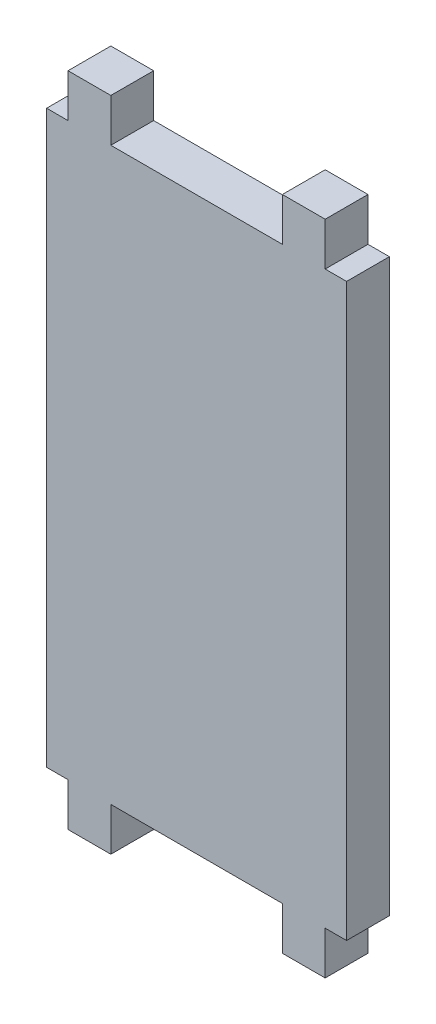
ISO-10303-21;
HEADER;
FILE_DESCRIPTION(('STEP AP214'),'2;1');
FILE_NAME('part.step','',(''),(''),'','','');
FILE_SCHEMA(('AUTOMOTIVE_DESIGN { 1 0 10303 214 1 1 1 1 }'));
ENDSEC;
DATA;
#1=APPLICATION_CONTEXT('core data for automotive mechanical design processes');
#2=APPLICATION_PROTOCOL_DEFINITION('international standard','automotive_design',2000,#1);
#3=PRODUCT_CONTEXT('',#1,'mechanical');
#4=PRODUCT('Part','Part','',(#3));
#5=PRODUCT_RELATED_PRODUCT_CATEGORY('part','',(#4));
#6=PRODUCT_DEFINITION_FORMATION('','',#4);
#7=PRODUCT_DEFINITION_CONTEXT('part definition',#1,'design');
#8=PRODUCT_DEFINITION('design','',#6,#7);
#9=PRODUCT_DEFINITION_SHAPE('','',#8);
#10=(LENGTH_UNIT() NAMED_UNIT(*) SI_UNIT(.MILLI.,.METRE.));
#11=(NAMED_UNIT(*) PLANE_ANGLE_UNIT() SI_UNIT($,.RADIAN.));
#12=(NAMED_UNIT(*) SI_UNIT($,.STERADIAN.) SOLID_ANGLE_UNIT());
#13=UNCERTAINTY_MEASURE_WITH_UNIT(LENGTH_MEASURE(1.E-05),#10,'distance_accuracy_value','');
#14=(GEOMETRIC_REPRESENTATION_CONTEXT(3) GLOBAL_UNCERTAINTY_ASSIGNED_CONTEXT((#13)) GLOBAL_UNIT_ASSIGNED_CONTEXT((#10,
#11,#12)) REPRESENTATION_CONTEXT('',''));
#15=CARTESIAN_POINT('',(0.,0.,0.));
#16=DIRECTION('',(0.,0.,1.));
#17=DIRECTION('',(1.,0.,0.));
#18=AXIS2_PLACEMENT_3D('',#15,#16,#17);
#19=CARTESIAN_POINT('',(31.9795138603937,110.,6.));
#20=DIRECTION('',(0.999999999991622,-4.09344864245869E-06,0.));
#21=DIRECTION('',(4.0934486424587E-06,0.999999999991622,0.));
#22=AXIS2_PLACEMENT_3D('',#19,#20,#21);
#23=PLANE('',#22);
#24=DIRECTION('',(-4.0934486424587E-06,-0.999999999991622,0.));
#25=VECTOR('',#24,1.);
#26=CARTESIAN_POINT('',(31.9795138603937,110.,0.));
#27=LINE('',#26,#25);
#28=CARTESIAN_POINT('',(31.9795138603937,110.,0.));
#29=VERTEX_POINT('',#28);
#30=CARTESIAN_POINT('',(31.9794890950294,103.95,0.));
#31=VERTEX_POINT('',#30);
#32=EDGE_CURVE('E202',#29,#31,#27,.T.);
#33=ORIENTED_EDGE('',*,*,#32,.T.);
#34=DIRECTION('',(0.,0.,-1.));
#35=VECTOR('',#34,1.);
#36=CARTESIAN_POINT('',(31.9794890950294,103.95,6.));
#37=LINE('',#36,#35);
#38=CARTESIAN_POINT('',(31.9794890950294,103.95,6.));
#39=VERTEX_POINT('',#38);
#40=EDGE_CURVE('E11',#39,#31,#37,.T.);
#41=ORIENTED_EDGE('',*,*,#40,.F.);
#42=DIRECTION('',(-4.0934486424587E-06,-0.999999999991622,0.));
#43=VECTOR('',#42,1.);
#44=CARTESIAN_POINT('',(31.9795138603937,110.,6.));
#45=LINE('',#44,#43);
#46=CARTESIAN_POINT('',(31.9795138603937,110.,6.));
#47=VERTEX_POINT('',#46);
#48=EDGE_CURVE('E240',#47,#39,#45,.T.);
#49=ORIENTED_EDGE('',*,*,#48,.F.);
#50=DIRECTION('',(0.,0.,-1.));
#51=VECTOR('',#50,1.);
#52=CARTESIAN_POINT('',(31.9795138603937,110.,6.));
#53=LINE('',#52,#51);
#54=EDGE_CURVE('E198',#47,#29,#53,.T.);
#55=ORIENTED_EDGE('',*,*,#54,.T.);
#56=EDGE_LOOP('',(#33,#41,#49,#55));
#57=FACE_BOUND('',#56,.T.);
#58=ADVANCED_FACE('F34',(#57),#23,.F.);
#59=CARTESIAN_POINT('',(31.9794890950294,103.95,6.));
#60=DIRECTION('',(0.,1.,0.));
#61=DIRECTION('',(0.,0.,1.));
#62=AXIS2_PLACEMENT_3D('',#59,#60,#61);
#63=PLANE('',#62);
#64=DIRECTION('',(1.,0.,0.));
#65=VECTOR('',#64,1.);
#66=CARTESIAN_POINT('',(31.9794890950294,103.95,0.));
#67=LINE('',#66,#65);
#68=CARTESIAN_POINT('',(37.9794890950797,103.95,0.));
#69=VERTEX_POINT('',#68);
#70=EDGE_CURVE('E205',#31,#69,#67,.T.);
#71=ORIENTED_EDGE('',*,*,#70,.T.);
#72=DIRECTION('',(0.,0.,-1.));
#73=VECTOR('',#72,1.);
#74=CARTESIAN_POINT('',(37.9794890950797,103.95,6.));
#75=LINE('',#74,#73);
#76=CARTESIAN_POINT('',(37.9794890950797,103.95,6.));
#77=VERTEX_POINT('',#76);
#78=EDGE_CURVE('E42',#77,#69,#75,.T.);
#79=ORIENTED_EDGE('',*,*,#78,.F.);
#80=DIRECTION('',(1.,0.,0.));
#81=VECTOR('',#80,1.);
#82=CARTESIAN_POINT('',(31.9794890950294,103.95,6.));
#83=LINE('',#82,#81);
#84=EDGE_CURVE('E129',#39,#77,#83,.T.);
#85=ORIENTED_EDGE('',*,*,#84,.F.);
#86=ORIENTED_EDGE('',*,*,#40,.T.);
#87=EDGE_LOOP('',(#71,#79,#85,#86));
#88=FACE_BOUND('',#87,.T.);
#89=ADVANCED_FACE('F358',(#88),#63,.F.);
#90=CARTESIAN_POINT('',(37.9795138604438,110.,6.));
#91=DIRECTION('',(-0.999999999991622,4.0934486241079E-06,0.));
#92=DIRECTION('',(-4.0934486241079E-06,-0.999999999991622,0.));
#93=AXIS2_PLACEMENT_3D('',#90,#91,#92);
#94=PLANE('',#93);
#95=DIRECTION('',(4.0934486241079E-06,0.999999999991622,0.));
#96=VECTOR('',#95,1.);
#97=CARTESIAN_POINT('',(37.9795138604438,110.,0.));
#98=LINE('',#97,#96);
#99=CARTESIAN_POINT('',(37.9795138604438,110.,0.));
#100=VERTEX_POINT('',#99);
#101=EDGE_CURVE('E207',#69,#100,#98,.T.);
#102=ORIENTED_EDGE('',*,*,#101,.T.);
#103=DIRECTION('',(0.,0.,-1.));
#104=VECTOR('',#103,1.);
#105=CARTESIAN_POINT('',(37.9795138604438,110.,6.));
#106=LINE('',#105,#104);
#107=CARTESIAN_POINT('',(37.9795138604438,110.,6.));
#108=VERTEX_POINT('',#107);
#109=EDGE_CURVE('E283',#108,#100,#106,.T.);
#110=ORIENTED_EDGE('',*,*,#109,.F.);
#111=DIRECTION('',(4.0934486241079E-06,0.999999999991622,0.));
#112=VECTOR('',#111,1.);
#113=CARTESIAN_POINT('',(37.9795138604438,110.,6.));
#114=LINE('',#113,#112);
#115=EDGE_CURVE('E291',#77,#108,#114,.T.);
#116=ORIENTED_EDGE('',*,*,#115,.F.);
#117=ORIENTED_EDGE('',*,*,#78,.T.);
#118=EDGE_LOOP('',(#102,#110,#116,#117));
#119=FACE_BOUND('',#118,.T.);
#120=ADVANCED_FACE('F289',(#119),#94,.F.);
#121=CARTESIAN_POINT('',(37.9795138604438,110.,6.));
#122=DIRECTION('',(0.,1.,0.));
#123=DIRECTION('',(0.,0.,1.));
#124=AXIS2_PLACEMENT_3D('',#121,#122,#123);
#125=PLANE('',#124);
#126=DIRECTION('',(1.,0.,0.));
#127=VECTOR('',#126,1.);
#128=CARTESIAN_POINT('',(37.9795138604438,110.,0.));
#129=LINE('',#128,#127);
#130=CARTESIAN_POINT('',(62.0197554376846,110.,0.));
#131=VERTEX_POINT('',#130);
#132=EDGE_CURVE('E209',#100,#131,#129,.T.);
#133=ORIENTED_EDGE('',*,*,#132,.T.);
#134=DIRECTION('',(0.,0.,-1.));
#135=VECTOR('',#134,1.);
#136=CARTESIAN_POINT('',(62.0197554376846,110.,6.));
#137=LINE('',#136,#135);
#138=CARTESIAN_POINT('',(62.0197554376846,110.,6.));
#139=VERTEX_POINT('',#138);
#140=EDGE_CURVE('E280',#139,#131,#137,.T.);
#141=ORIENTED_EDGE('',*,*,#140,.F.);
#142=DIRECTION('',(1.,0.,0.));
#143=VECTOR('',#142,1.);
#144=CARTESIAN_POINT('',(37.9795138604438,110.,6.));
#145=LINE('',#144,#143);
#146=EDGE_CURVE('E309',#108,#139,#145,.T.);
#147=ORIENTED_EDGE('',*,*,#146,.F.);
#148=ORIENTED_EDGE('',*,*,#109,.T.);
#149=EDGE_LOOP('',(#133,#141,#147,#148));
#150=FACE_BOUND('',#149,.T.);
#151=ADVANCED_FACE('F300',(#150),#125,.F.);
#152=CARTESIAN_POINT('',(62.0196696845161,103.95,6.));
#153=DIRECTION('',(0.999999999899548,-1.41740774406321E-05,0.));
#154=DIRECTION('',(1.41740774406321E-05,0.999999999899548,0.));
#155=AXIS2_PLACEMENT_3D('',#152,#153,#154);
#156=PLANE('',#155);
#157=DIRECTION('',(-1.41740774406321E-05,-0.999999999899548,0.));
#158=VECTOR('',#157,1.);
#159=CARTESIAN_POINT('',(62.0196696845161,103.95,0.));
#160=LINE('',#159,#158);
#161=CARTESIAN_POINT('',(62.0196696845161,103.95,0.));
#162=VERTEX_POINT('',#161);
#163=EDGE_CURVE('E211',#131,#162,#160,.T.);
#164=ORIENTED_EDGE('',*,*,#163,.T.);
#165=DIRECTION('',(0.,0.,-1.));
#166=VECTOR('',#165,1.);
#167=CARTESIAN_POINT('',(62.0196696845161,103.95,6.));
#168=LINE('',#167,#166);
#169=CARTESIAN_POINT('',(62.0196696845161,103.95,6.));
#170=VERTEX_POINT('',#169);
#171=EDGE_CURVE('E277',#170,#162,#168,.T.);
#172=ORIENTED_EDGE('',*,*,#171,.F.);
#173=DIRECTION('',(-1.41740774406321E-05,-0.999999999899548,0.));
#174=VECTOR('',#173,1.);
#175=CARTESIAN_POINT('',(62.0196696845161,103.95,6.));
#176=LINE('',#175,#174);
#177=EDGE_CURVE('E306',#139,#170,#176,.T.);
#178=ORIENTED_EDGE('',*,*,#177,.F.);
#179=ORIENTED_EDGE('',*,*,#140,.T.);
#180=EDGE_LOOP('',(#164,#172,#178,#179));
#181=FACE_BOUND('',#180,.T.);
#182=ADVANCED_FACE('F304',(#181),#156,.F.);
#183=CARTESIAN_POINT('',(62.0196696845161,103.95,6.));
#184=DIRECTION('',(0.,1.,0.));
#185=DIRECTION('',(0.,0.,1.));
#186=AXIS2_PLACEMENT_3D('',#183,#184,#185);
#187=PLANE('',#186);
#188=DIRECTION('',(1.,0.,0.));
#189=VECTOR('',#188,1.);
#190=CARTESIAN_POINT('',(62.0196696845161,103.95,0.));
#191=LINE('',#190,#189);
#192=CARTESIAN_POINT('',(68.0196696851188,103.95,0.));
#193=VERTEX_POINT('',#192);
#194=EDGE_CURVE('E213',#162,#193,#191,.T.);
#195=ORIENTED_EDGE('',*,*,#194,.T.);
#196=DIRECTION('',(0.,0.,-1.));
#197=VECTOR('',#196,1.);
#198=CARTESIAN_POINT('',(68.0196696851188,103.95,6.));
#199=LINE('',#198,#197);
#200=CARTESIAN_POINT('',(68.0196696851188,103.95,6.));
#201=VERTEX_POINT('',#200);
#202=EDGE_CURVE('E274',#201,#193,#199,.T.);
#203=ORIENTED_EDGE('',*,*,#202,.F.);
#204=DIRECTION('',(1.,0.,0.));
#205=VECTOR('',#204,1.);
#206=CARTESIAN_POINT('',(62.0196696845161,103.95,6.));
#207=LINE('',#206,#205);
#208=EDGE_CURVE('E308',#170,#201,#207,.T.);
#209=ORIENTED_EDGE('',*,*,#208,.F.);
#210=ORIENTED_EDGE('',*,*,#171,.T.);
#211=EDGE_LOOP('',(#195,#203,#209,#210));
#212=FACE_BOUND('',#211,.T.);
#213=ADVANCED_FACE('F371',(#212),#187,.F.);
#214=CARTESIAN_POINT('',(68.0196696851188,103.95,6.));
#215=DIRECTION('',(-0.999999999899548,1.41740774406321E-05,0.));
#216=DIRECTION('',(-1.41740774406321E-05,-0.999999999899548,0.));
#217=AXIS2_PLACEMENT_3D('',#214,#215,#216);
#218=PLANE('',#217);
#219=DIRECTION('',(1.41740774406321E-05,0.999999999899548,0.));
#220=VECTOR('',#219,1.);
#221=CARTESIAN_POINT('',(68.0196696851188,103.95,0.));
#222=LINE('',#221,#220);
#223=CARTESIAN_POINT('',(68.0197554382873,110.,0.));
#224=VERTEX_POINT('',#223);
#225=EDGE_CURVE('E215',#193,#224,#222,.T.);
#226=ORIENTED_EDGE('',*,*,#225,.T.);
#227=DIRECTION('',(0.,0.,-1.));
#228=VECTOR('',#227,1.);
#229=CARTESIAN_POINT('',(68.0197554382873,110.,6.));
#230=LINE('',#229,#228);
#231=CARTESIAN_POINT('',(68.0197554382873,110.,6.));
#232=VERTEX_POINT('',#231);
#233=EDGE_CURVE('E271',#232,#224,#230,.T.);
#234=ORIENTED_EDGE('',*,*,#233,.F.);
#235=DIRECTION('',(1.41740774406321E-05,0.999999999899548,0.));
#236=VECTOR('',#235,1.);
#237=CARTESIAN_POINT('',(68.0196696851188,103.95,6.));
#238=LINE('',#237,#236);
#239=EDGE_CURVE('E311',#201,#232,#238,.T.);
#240=ORIENTED_EDGE('',*,*,#239,.F.);
#241=ORIENTED_EDGE('',*,*,#202,.T.);
#242=EDGE_LOOP('',(#226,#234,#240,#241));
#243=FACE_BOUND('',#242,.T.);
#244=ADVANCED_FACE('F374',(#243),#218,.F.);
#245=CARTESIAN_POINT('',(68.0197554382873,110.,6.));
#246=DIRECTION('',(0.,1.,0.));
#247=DIRECTION('',(0.,0.,1.));
#248=AXIS2_PLACEMENT_3D('',#245,#246,#247);
#249=PLANE('',#248);
#250=DIRECTION('',(1.,0.,0.));
#251=VECTOR('',#250,1.);
#252=CARTESIAN_POINT('',(68.0197554382873,110.,0.));
#253=LINE('',#252,#251);
#254=CARTESIAN_POINT('',(71.0197554385887,110.,0.));
#255=VERTEX_POINT('',#254);
#256=EDGE_CURVE('E217',#224,#255,#253,.T.);
#257=ORIENTED_EDGE('',*,*,#256,.T.);
#258=DIRECTION('',(0.,0.,-1.));
#259=VECTOR('',#258,1.);
#260=CARTESIAN_POINT('',(71.0197554385887,110.,6.));
#261=LINE('',#260,#259);
#262=CARTESIAN_POINT('',(71.0197554385887,110.,6.));
#263=VERTEX_POINT('',#262);
#264=EDGE_CURVE('E268',#263,#255,#261,.T.);
#265=ORIENTED_EDGE('',*,*,#264,.F.);
#266=DIRECTION('',(1.,0.,0.));
#267=VECTOR('',#266,1.);
#268=CARTESIAN_POINT('',(68.0197554382873,110.,6.));
#269=LINE('',#268,#267);
#270=EDGE_CURVE('E317',#232,#263,#269,.T.);
#271=ORIENTED_EDGE('',*,*,#270,.F.);
#272=ORIENTED_EDGE('',*,*,#233,.T.);
#273=EDGE_LOOP('',(#257,#265,#271,#272));
#274=FACE_BOUND('',#273,.T.);
#275=ADVANCED_FACE('F378',(#274),#249,.F.);
#276=CARTESIAN_POINT('',(71.0197554385887,110.,6.));
#277=DIRECTION('',(-0.999999999899548,1.41740774398436E-05,0.));
#278=DIRECTION('',(-1.41740774398436E-05,-0.999999999899548,0.));
#279=AXIS2_PLACEMENT_3D('',#276,#277,#278);
#280=PLANE('',#279);
#281=DIRECTION('',(1.41740774398436E-05,0.999999999899548,0.));
#282=VECTOR('',#281,1.);
#283=CARTESIAN_POINT('',(71.0197554385887,110.,0.));
#284=LINE('',#283,#282);
#285=CARTESIAN_POINT('',(71.020889364784,190.,0.));
#286=VERTEX_POINT('',#285);
#287=EDGE_CURVE('E219',#255,#286,#284,.T.);
#288=ORIENTED_EDGE('',*,*,#287,.T.);
#289=DIRECTION('',(0.,0.,-1.));
#290=VECTOR('',#289,1.);
#291=CARTESIAN_POINT('',(71.020889364784,190.,6.));
#292=LINE('',#291,#290);
#293=CARTESIAN_POINT('',(71.020889364784,190.,6.));
#294=VERTEX_POINT('',#293);
#295=EDGE_CURVE('E265',#294,#286,#292,.T.);
#296=ORIENTED_EDGE('',*,*,#295,.F.);
#297=DIRECTION('',(1.41740774398436E-05,0.999999999899548,0.));
#298=VECTOR('',#297,1.);
#299=CARTESIAN_POINT('',(71.0197554385887,110.,6.));
#300=LINE('',#299,#298);
#301=EDGE_CURVE('E319',#263,#294,#300,.T.);
#302=ORIENTED_EDGE('',*,*,#301,.F.);
#303=ORIENTED_EDGE('',*,*,#264,.T.);
#304=EDGE_LOOP('',(#288,#296,#302,#303));
#305=FACE_BOUND('',#304,.T.);
#306=ADVANCED_FACE('F382',(#305),#280,.F.);
#307=CARTESIAN_POINT('',(68.0208893644827,190.,6.));
#308=DIRECTION('',(0.,-1.,0.));
#309=DIRECTION('',(0.,0.,-1.));
#310=AXIS2_PLACEMENT_3D('',#307,#308,#309);
#311=PLANE('',#310);
#312=DIRECTION('',(-1.,0.,0.));
#313=VECTOR('',#312,1.);
#314=CARTESIAN_POINT('',(68.0208893644827,190.,0.));
#315=LINE('',#314,#313);
#316=CARTESIAN_POINT('',(68.0208893644827,190.,0.));
#317=VERTEX_POINT('',#316);
#318=EDGE_CURVE('E221',#286,#317,#315,.T.);
#319=ORIENTED_EDGE('',*,*,#318,.T.);
#320=DIRECTION('',(0.,0.,-1.));
#321=VECTOR('',#320,1.);
#322=CARTESIAN_POINT('',(68.0208893644827,190.,6.));
#323=LINE('',#322,#321);
#324=CARTESIAN_POINT('',(68.0208893644827,190.,6.));
#325=VERTEX_POINT('',#324);
#326=EDGE_CURVE('E262',#325,#317,#323,.T.);
#327=ORIENTED_EDGE('',*,*,#326,.F.);
#328=DIRECTION('',(-1.,0.,0.));
#329=VECTOR('',#328,1.);
#330=CARTESIAN_POINT('',(68.0208893644827,190.,6.));
#331=LINE('',#330,#329);
#332=EDGE_CURVE('E321',#294,#325,#331,.T.);
#333=ORIENTED_EDGE('',*,*,#332,.F.);
#334=ORIENTED_EDGE('',*,*,#295,.T.);
#335=EDGE_LOOP('',(#319,#327,#333,#334));
#336=FACE_BOUND('',#335,.T.);
#337=ADVANCED_FACE('F386',(#336),#311,.F.);
#338=CARTESIAN_POINT('',(68.0208893644827,190.,6.));
#339=DIRECTION('',(-0.999999999899548,1.41740774406321E-05,0.));
#340=DIRECTION('',(-1.41740774406321E-05,-0.999999999899548,0.));
#341=AXIS2_PLACEMENT_3D('',#338,#339,#340);
#342=PLANE('',#341);
#343=DIRECTION('',(1.41740774406321E-05,0.999999999899548,0.));
#344=VECTOR('',#343,1.);
#345=CARTESIAN_POINT('',(68.0208893644827,190.,0.));
#346=LINE('',#345,#344);
#347=CARTESIAN_POINT('',(68.0209751176512,196.05,0.));
#348=VERTEX_POINT('',#347);
#349=EDGE_CURVE('E223',#317,#348,#346,.T.);
#350=ORIENTED_EDGE('',*,*,#349,.T.);
#351=DIRECTION('',(0.,0.,-1.));
#352=VECTOR('',#351,1.);
#353=CARTESIAN_POINT('',(68.0209751176512,196.05,6.));
#354=LINE('',#353,#352);
#355=CARTESIAN_POINT('',(68.0209751176512,196.05,6.));
#356=VERTEX_POINT('',#355);
#357=EDGE_CURVE('E259',#356,#348,#354,.T.);
#358=ORIENTED_EDGE('',*,*,#357,.F.);
#359=DIRECTION('',(1.41740774406321E-05,0.999999999899548,0.));
#360=VECTOR('',#359,1.);
#361=CARTESIAN_POINT('',(68.0208893644827,190.,6.));
#362=LINE('',#361,#360);
#363=EDGE_CURVE('E323',#325,#356,#362,.T.);
#364=ORIENTED_EDGE('',*,*,#363,.F.);
#365=ORIENTED_EDGE('',*,*,#326,.T.);
#366=EDGE_LOOP('',(#350,#358,#364,#365));
#367=FACE_BOUND('',#366,.T.);
#368=ADVANCED_FACE('F390',(#367),#342,.F.);
#369=CARTESIAN_POINT('',(62.0209751170485,196.05,6.));
#370=DIRECTION('',(0.,-1.,0.));
#371=DIRECTION('',(0.,0.,-1.));
#372=AXIS2_PLACEMENT_3D('',#369,#370,#371);
#373=PLANE('',#372);
#374=DIRECTION('',(-1.,0.,0.));
#375=VECTOR('',#374,1.);
#376=CARTESIAN_POINT('',(62.0209751170485,196.05,0.));
#377=LINE('',#376,#375);
#378=CARTESIAN_POINT('',(62.0209751170485,196.05,0.));
#379=VERTEX_POINT('',#378);
#380=EDGE_CURVE('E225',#348,#379,#377,.T.);
#381=ORIENTED_EDGE('',*,*,#380,.T.);
#382=DIRECTION('',(0.,0.,-1.));
#383=VECTOR('',#382,1.);
#384=CARTESIAN_POINT('',(62.0209751170485,196.05,6.));
#385=LINE('',#384,#383);
#386=CARTESIAN_POINT('',(62.0209751170485,196.05,6.));
#387=VERTEX_POINT('',#386);
#388=EDGE_CURVE('E256',#387,#379,#385,.T.);
#389=ORIENTED_EDGE('',*,*,#388,.F.);
#390=DIRECTION('',(-1.,0.,0.));
#391=VECTOR('',#390,1.);
#392=CARTESIAN_POINT('',(62.0209751170485,196.05,6.));
#393=LINE('',#392,#391);
#394=EDGE_CURVE('E325',#356,#387,#393,.T.);
#395=ORIENTED_EDGE('',*,*,#394,.F.);
#396=ORIENTED_EDGE('',*,*,#357,.T.);
#397=EDGE_LOOP('',(#381,#389,#395,#396));
#398=FACE_BOUND('',#397,.T.);
#399=ADVANCED_FACE('F394',(#398),#373,.F.);
#400=CARTESIAN_POINT('',(62.02088936388,190.,6.));
#401=DIRECTION('',(0.999999999899548,-1.41740774394852E-05,0.));
#402=DIRECTION('',(1.41740774394852E-05,0.999999999899548,0.));
#403=AXIS2_PLACEMENT_3D('',#400,#401,#402);
#404=PLANE('',#403);
#405=DIRECTION('',(-1.41740774394852E-05,-0.999999999899548,0.));
#406=VECTOR('',#405,1.);
#407=CARTESIAN_POINT('',(62.02088936388,190.,0.));
#408=LINE('',#407,#406);
#409=CARTESIAN_POINT('',(62.02088936388,190.,0.));
#410=VERTEX_POINT('',#409);
#411=EDGE_CURVE('E227',#379,#410,#408,.T.);
#412=ORIENTED_EDGE('',*,*,#411,.T.);
#413=DIRECTION('',(0.,0.,-1.));
#414=VECTOR('',#413,1.);
#415=CARTESIAN_POINT('',(62.02088936388,190.,6.));
#416=LINE('',#415,#414);
#417=CARTESIAN_POINT('',(62.02088936388,190.,6.));
#418=VERTEX_POINT('',#417);
#419=EDGE_CURVE('E253',#418,#410,#416,.T.);
#420=ORIENTED_EDGE('',*,*,#419,.F.);
#421=DIRECTION('',(-1.41740774394852E-05,-0.999999999899548,0.));
#422=VECTOR('',#421,1.);
#423=CARTESIAN_POINT('',(62.02088936388,190.,6.));
#424=LINE('',#423,#422);
#425=EDGE_CURVE('E327',#387,#418,#424,.T.);
#426=ORIENTED_EDGE('',*,*,#425,.F.);
#427=ORIENTED_EDGE('',*,*,#388,.T.);
#428=EDGE_LOOP('',(#412,#420,#426,#427));
#429=FACE_BOUND('',#428,.T.);
#430=ADVANCED_FACE('F398',(#429),#404,.F.);
#431=CARTESIAN_POINT('',(37.9798413363337,190.,6.));
#432=DIRECTION('',(0.,-1.,0.));
#433=DIRECTION('',(0.,0.,-1.));
#434=AXIS2_PLACEMENT_3D('',#431,#432,#433);
#435=PLANE('',#434);
#436=DIRECTION('',(-1.,0.,0.));
#437=VECTOR('',#436,1.);
#438=CARTESIAN_POINT('',(37.9798413363337,190.,0.));
#439=LINE('',#438,#437);
#440=CARTESIAN_POINT('',(37.9798413363337,190.,0.));
#441=VERTEX_POINT('',#440);
#442=EDGE_CURVE('E229',#410,#441,#439,.T.);
#443=ORIENTED_EDGE('',*,*,#442,.T.);
#444=DIRECTION('',(0.,0.,-1.));
#445=VECTOR('',#444,1.);
#446=CARTESIAN_POINT('',(37.9798413363337,190.,6.));
#447=LINE('',#446,#445);
#448=CARTESIAN_POINT('',(37.9798413363337,190.,6.));
#449=VERTEX_POINT('',#448);
#450=EDGE_CURVE('E250',#449,#441,#447,.T.);
#451=ORIENTED_EDGE('',*,*,#450,.F.);
#452=DIRECTION('',(-1.,0.,0.));
#453=VECTOR('',#452,1.);
#454=CARTESIAN_POINT('',(37.9798413363337,190.,6.));
#455=LINE('',#454,#453);
#456=EDGE_CURVE('E329',#418,#449,#455,.T.);
#457=ORIENTED_EDGE('',*,*,#456,.F.);
#458=ORIENTED_EDGE('',*,*,#419,.T.);
#459=EDGE_LOOP('',(#443,#451,#457,#458));
#460=FACE_BOUND('',#459,.T.);
#461=ADVANCED_FACE('F402',(#460),#435,.F.);
#462=CARTESIAN_POINT('',(37.9798661016979,196.05,6.));
#463=DIRECTION('',(-0.999999999991622,4.09344862410791E-06,0.));
#464=DIRECTION('',(-4.09344862410791E-06,-0.999999999991622,0.));
#465=AXIS2_PLACEMENT_3D('',#462,#463,#464);
#466=PLANE('',#465);
#467=DIRECTION('',(4.09344862410791E-06,0.999999999991622,0.));
#468=VECTOR('',#467,1.);
#469=CARTESIAN_POINT('',(37.9798661016979,196.05,0.));
#470=LINE('',#469,#468);
#471=CARTESIAN_POINT('',(37.9798661016979,196.05,0.));
#472=VERTEX_POINT('',#471);
#473=EDGE_CURVE('E231',#441,#472,#470,.T.);
#474=ORIENTED_EDGE('',*,*,#473,.T.);
#475=DIRECTION('',(0.,0.,-1.));
#476=VECTOR('',#475,1.);
#477=CARTESIAN_POINT('',(37.9798661016979,196.05,6.));
#478=LINE('',#477,#476);
#479=CARTESIAN_POINT('',(37.9798661016979,196.05,6.));
#480=VERTEX_POINT('',#479);
#481=EDGE_CURVE('E247',#480,#472,#478,.T.);
#482=ORIENTED_EDGE('',*,*,#481,.F.);
#483=DIRECTION('',(4.09344862410791E-06,0.999999999991622,0.));
#484=VECTOR('',#483,1.);
#485=CARTESIAN_POINT('',(37.9798661016979,196.05,6.));
#486=LINE('',#485,#484);
#487=EDGE_CURVE('E331',#449,#480,#486,.T.);
#488=ORIENTED_EDGE('',*,*,#487,.F.);
#489=ORIENTED_EDGE('',*,*,#450,.T.);
#490=EDGE_LOOP('',(#474,#482,#488,#489));
#491=FACE_BOUND('',#490,.T.);
#492=ADVANCED_FACE('F406',(#491),#466,.F.);
#493=CARTESIAN_POINT('',(31.9798661016486,196.05,6.));
#494=DIRECTION('',(0.,-1.,0.));
#495=DIRECTION('',(0.,0.,-1.));
#496=AXIS2_PLACEMENT_3D('',#493,#494,#495);
#497=PLANE('',#496);
#498=DIRECTION('',(-1.,0.,0.));
#499=VECTOR('',#498,1.);
#500=CARTESIAN_POINT('',(31.9798661016486,196.05,0.));
#501=LINE('',#500,#499);
#502=CARTESIAN_POINT('',(31.9798661016486,196.05,0.));
#503=VERTEX_POINT('',#502);
#504=EDGE_CURVE('E233',#472,#503,#501,.T.);
#505=ORIENTED_EDGE('',*,*,#504,.T.);
#506=DIRECTION('',(0.,0.,-1.));
#507=VECTOR('',#506,1.);
#508=CARTESIAN_POINT('',(31.9798661016486,196.05,6.));
#509=LINE('',#508,#507);
#510=CARTESIAN_POINT('',(31.9798661016486,196.05,6.));
#511=VERTEX_POINT('',#510);
#512=EDGE_CURVE('E244',#511,#503,#509,.T.);
#513=ORIENTED_EDGE('',*,*,#512,.F.);
#514=DIRECTION('',(-1.,0.,0.));
#515=VECTOR('',#514,1.);
#516=CARTESIAN_POINT('',(31.9798661016486,196.05,6.));
#517=LINE('',#516,#515);
#518=EDGE_CURVE('E333',#480,#511,#517,.T.);
#519=ORIENTED_EDGE('',*,*,#518,.F.);
#520=ORIENTED_EDGE('',*,*,#481,.T.);
#521=EDGE_LOOP('',(#505,#513,#519,#520));
#522=FACE_BOUND('',#521,.T.);
#523=ADVANCED_FACE('F339',(#522),#497,.F.);
#524=CARTESIAN_POINT('',(31.9798661016486,196.05,6.));
#525=DIRECTION('',(0.999999999991622,-4.0934486424587E-06,0.));
#526=DIRECTION('',(4.0934486424587E-06,0.999999999991622,0.));
#527=AXIS2_PLACEMENT_3D('',#524,#525,#526);
#528=PLANE('',#527);
#529=DIRECTION('',(-4.0934486424587E-06,-0.999999999991622,0.));
#530=VECTOR('',#529,1.);
#531=CARTESIAN_POINT('',(31.9798661016486,196.05,0.));
#532=LINE('',#531,#530);
#533=CARTESIAN_POINT('',(31.9798413362843,190.,0.));
#534=VERTEX_POINT('',#533);
#535=EDGE_CURVE('E235',#503,#534,#532,.T.);
#536=ORIENTED_EDGE('',*,*,#535,.T.);
#537=DIRECTION('',(0.,0.,-1.));
#538=VECTOR('',#537,1.);
#539=CARTESIAN_POINT('',(31.9798413362843,190.,6.));
#540=LINE('',#539,#538);
#541=CARTESIAN_POINT('',(31.9798413362843,190.,6.));
#542=VERTEX_POINT('',#541);
#543=EDGE_CURVE('E193',#542,#534,#540,.T.);
#544=ORIENTED_EDGE('',*,*,#543,.F.);
#545=DIRECTION('',(-4.0934486424587E-06,-0.999999999991622,0.));
#546=VECTOR('',#545,1.);
#547=CARTESIAN_POINT('',(31.9798661016486,196.05,6.));
#548=LINE('',#547,#546);
#549=EDGE_CURVE('E184',#511,#542,#548,.T.);
#550=ORIENTED_EDGE('',*,*,#549,.F.);
#551=ORIENTED_EDGE('',*,*,#512,.T.);
#552=EDGE_LOOP('',(#536,#544,#550,#551));
#553=FACE_BOUND('',#552,.T.);
#554=ADVANCED_FACE('F343',(#553),#528,.F.);
#555=CARTESIAN_POINT('',(28.9794890950043,190.,6.));
#556=DIRECTION('',(0.,-1.,0.));
#557=DIRECTION('',(0.,0.,-1.));
#558=AXIS2_PLACEMENT_3D('',#555,#556,#557);
#559=PLANE('',#558);
#560=DIRECTION('',(-1.,0.,0.));
#561=VECTOR('',#560,1.);
#562=CARTESIAN_POINT('',(28.9794890950043,190.,0.));
#563=LINE('',#562,#561);
#564=CARTESIAN_POINT('',(28.9794890950043,190.,0.));
#565=VERTEX_POINT('',#564);
#566=EDGE_CURVE('E192',#534,#565,#563,.T.);
#567=ORIENTED_EDGE('',*,*,#566,.T.);
#568=DIRECTION('',(0.,0.,-1.));
#569=VECTOR('',#568,1.);
#570=CARTESIAN_POINT('',(28.9794890950043,190.,6.));
#571=LINE('',#570,#569);
#572=CARTESIAN_POINT('',(28.9794890950043,190.,6.));
#573=VERTEX_POINT('',#572);
#574=EDGE_CURVE('E189',#573,#565,#571,.T.);
#575=ORIENTED_EDGE('',*,*,#574,.F.);
#576=DIRECTION('',(-1.,0.,0.));
#577=VECTOR('',#576,1.);
#578=CARTESIAN_POINT('',(28.9794890950043,190.,6.));
#579=LINE('',#578,#577);
#580=EDGE_CURVE('E178',#542,#573,#579,.T.);
#581=ORIENTED_EDGE('',*,*,#580,.F.);
#582=ORIENTED_EDGE('',*,*,#543,.T.);
#583=EDGE_LOOP('',(#567,#575,#581,#582));
#584=FACE_BOUND('',#583,.T.);
#585=ADVANCED_FACE('F190',(#584),#559,.F.);
#586=CARTESIAN_POINT('',(28.9794890950043,190.,6.));
#587=DIRECTION('',(1.,0.,0.));
#588=DIRECTION('',(0.,0.,-1.));
#589=AXIS2_PLACEMENT_3D('',#586,#587,#588);
#590=PLANE('',#589);
#591=DIRECTION('',(0.,-1.,0.));
#592=VECTOR('',#591,1.);
#593=CARTESIAN_POINT('',(28.9794890950043,190.,0.));
#594=LINE('',#593,#592);
#595=CARTESIAN_POINT('',(28.9794890950043,110.,0.));
#596=VERTEX_POINT('',#595);
#597=EDGE_CURVE('E115',#565,#596,#594,.T.);
#598=ORIENTED_EDGE('',*,*,#597,.T.);
#599=DIRECTION('',(0.,0.,-1.));
#600=VECTOR('',#599,1.);
#601=CARTESIAN_POINT('',(28.9794890950043,110.,6.));
#602=LINE('',#601,#600);
#603=CARTESIAN_POINT('',(28.9794890950043,110.,6.));
#604=VERTEX_POINT('',#603);
#605=EDGE_CURVE('E194',#604,#596,#602,.T.);
#606=ORIENTED_EDGE('',*,*,#605,.F.);
#607=DIRECTION('',(0.,-1.,0.));
#608=VECTOR('',#607,1.);
#609=CARTESIAN_POINT('',(28.9794890950043,190.,6.));
#610=LINE('',#609,#608);
#611=EDGE_CURVE('E182',#573,#604,#610,.T.);
#612=ORIENTED_EDGE('',*,*,#611,.F.);
#613=ORIENTED_EDGE('',*,*,#574,.T.);
#614=EDGE_LOOP('',(#598,#606,#612,#613));
#615=FACE_BOUND('',#614,.T.);
#616=ADVANCED_FACE('F196',(#615),#590,.F.);
#617=CARTESIAN_POINT('',(28.9794890950043,110.,6.));
#618=DIRECTION('',(0.,1.,0.));
#619=DIRECTION('',(0.,0.,1.));
#620=AXIS2_PLACEMENT_3D('',#617,#618,#619);
#621=PLANE('',#620);
#622=DIRECTION('',(1.,0.,0.));
#623=VECTOR('',#622,1.);
#624=CARTESIAN_POINT('',(28.9794890950043,110.,0.));
#625=LINE('',#624,#623);
#626=EDGE_CURVE('E121',#596,#29,#625,.T.);
#627=ORIENTED_EDGE('',*,*,#626,.T.);
#628=ORIENTED_EDGE('',*,*,#54,.F.);
#629=DIRECTION('',(1.,0.,0.));
#630=VECTOR('',#629,1.);
#631=CARTESIAN_POINT('',(28.9794890950043,110.,6.));
#632=LINE('',#631,#630);
#633=EDGE_CURVE('E50',#604,#47,#632,.T.);
#634=ORIENTED_EDGE('',*,*,#633,.F.);
#635=ORIENTED_EDGE('',*,*,#605,.T.);
#636=EDGE_LOOP('',(#627,#628,#634,#635));
#637=FACE_BOUND('',#636,.T.);
#638=ADVANCED_FACE('F347',(#637),#621,.F.);
#639=CARTESIAN_POINT('',(0.,0.,6.));
#640=DIRECTION('',(0.,0.,1.));
#641=DIRECTION('',(1.,0.,0.));
#642=AXIS2_PLACEMENT_3D('',#639,#640,#641);
#643=PLANE('',#642);
#644=ORIENTED_EDGE('',*,*,#48,.T.);
#645=ORIENTED_EDGE('',*,*,#84,.T.);
#646=ORIENTED_EDGE('',*,*,#115,.T.);
#647=ORIENTED_EDGE('',*,*,#146,.T.);
#648=ORIENTED_EDGE('',*,*,#177,.T.);
#649=ORIENTED_EDGE('',*,*,#208,.T.);
#650=ORIENTED_EDGE('',*,*,#239,.T.);
#651=ORIENTED_EDGE('',*,*,#270,.T.);
#652=ORIENTED_EDGE('',*,*,#301,.T.);
#653=ORIENTED_EDGE('',*,*,#332,.T.);
#654=ORIENTED_EDGE('',*,*,#363,.T.);
#655=ORIENTED_EDGE('',*,*,#394,.T.);
#656=ORIENTED_EDGE('',*,*,#425,.T.);
#657=ORIENTED_EDGE('',*,*,#456,.T.);
#658=ORIENTED_EDGE('',*,*,#487,.T.);
#659=ORIENTED_EDGE('',*,*,#518,.T.);
#660=ORIENTED_EDGE('',*,*,#549,.T.);
#661=ORIENTED_EDGE('',*,*,#580,.T.);
#662=ORIENTED_EDGE('',*,*,#611,.T.);
#663=ORIENTED_EDGE('',*,*,#633,.T.);
#664=EDGE_LOOP('',(#644,#645,#646,#647,#648,#649,#650,#651,#652,#653,#654,#655,#656,#657,#658,
#659,#660,#661,#662,#663));
#665=FACE_BOUND('',#664,.T.);
#666=ADVANCED_FACE('F180',(#665),#643,.T.);
#667=CARTESIAN_POINT('',(0.,0.,0.));
#668=DIRECTION('',(0.,0.,1.));
#669=DIRECTION('',(1.,0.,0.));
#670=AXIS2_PLACEMENT_3D('',#667,#668,#669);
#671=PLANE('',#670);
#672=ORIENTED_EDGE('',*,*,#32,.F.);
#673=ORIENTED_EDGE('',*,*,#626,.F.);
#674=ORIENTED_EDGE('',*,*,#597,.F.);
#675=ORIENTED_EDGE('',*,*,#566,.F.);
#676=ORIENTED_EDGE('',*,*,#535,.F.);
#677=ORIENTED_EDGE('',*,*,#504,.F.);
#678=ORIENTED_EDGE('',*,*,#473,.F.);
#679=ORIENTED_EDGE('',*,*,#442,.F.);
#680=ORIENTED_EDGE('',*,*,#411,.F.);
#681=ORIENTED_EDGE('',*,*,#380,.F.);
#682=ORIENTED_EDGE('',*,*,#349,.F.);
#683=ORIENTED_EDGE('',*,*,#318,.F.);
#684=ORIENTED_EDGE('',*,*,#287,.F.);
#685=ORIENTED_EDGE('',*,*,#256,.F.);
#686=ORIENTED_EDGE('',*,*,#225,.F.);
#687=ORIENTED_EDGE('',*,*,#194,.F.);
#688=ORIENTED_EDGE('',*,*,#163,.F.);
#689=ORIENTED_EDGE('',*,*,#132,.F.);
#690=ORIENTED_EDGE('',*,*,#101,.F.);
#691=ORIENTED_EDGE('',*,*,#70,.F.);
#692=EDGE_LOOP('',(#672,#673,#674,#675,#676,#677,#678,#679,#680,#681,#682,#683,#684,#685,#686,
#687,#688,#689,#690,#691));
#693=FACE_BOUND('',#692,.T.);
#694=ADVANCED_FACE('F295',(#693),#671,.F.);
#695=CLOSED_SHELL('',(#58,#89,#120,#151,#182,#213,#244,#275,#306,#337,#368,#399,#430,#461,#492,
#523,#554,#585,#616,#638,#666,#694));
#696=MANIFOLD_SOLID_BREP('B2',#695);
#697=ADVANCED_BREP_SHAPE_REPRESENTATION('',(#18,#696),#14);
#698=SHAPE_DEFINITION_REPRESENTATION(#9,#697);
ENDSEC;
END-ISO-10303-21;
